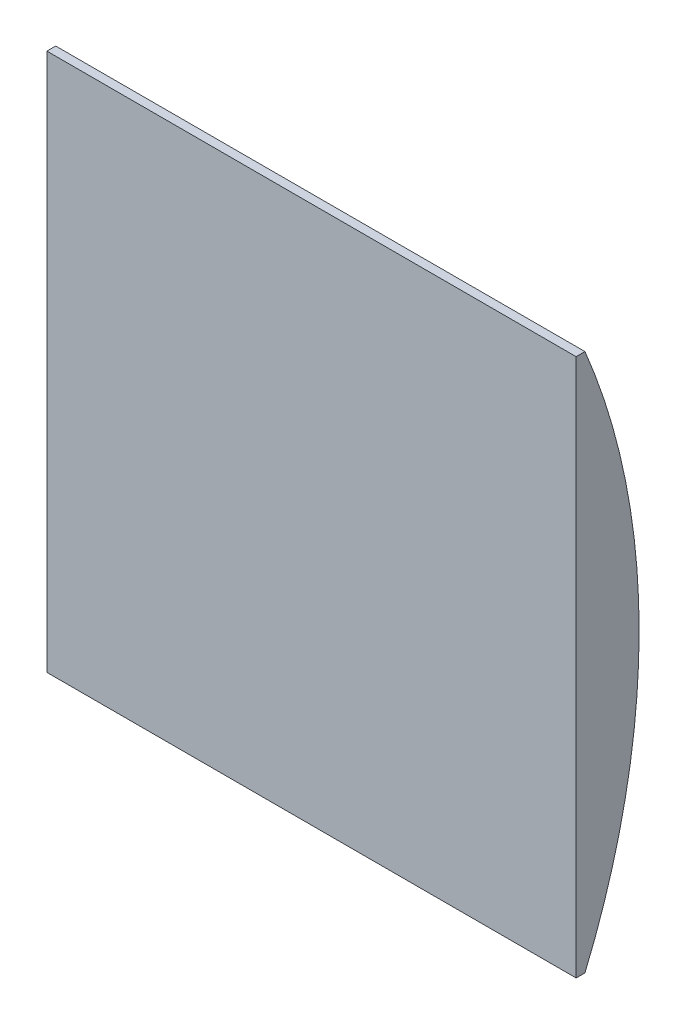
ISO-10303-21;
HEADER;
FILE_DESCRIPTION(('STEP AP214'),'2;1');
FILE_NAME('part.step','',(''),(''),'','','');
FILE_SCHEMA(('AUTOMOTIVE_DESIGN { 1 0 10303 214 1 1 1 1 }'));
ENDSEC;
DATA;
#1=APPLICATION_CONTEXT('core data for automotive mechanical design processes');
#2=APPLICATION_PROTOCOL_DEFINITION('international standard','automotive_design',2000,#1);
#3=PRODUCT_CONTEXT('',#1,'mechanical');
#4=PRODUCT('Part','Part','',(#3));
#5=PRODUCT_RELATED_PRODUCT_CATEGORY('part','',(#4));
#6=PRODUCT_DEFINITION_FORMATION('','',#4);
#7=PRODUCT_DEFINITION_CONTEXT('part definition',#1,'design');
#8=PRODUCT_DEFINITION('design','',#6,#7);
#9=PRODUCT_DEFINITION_SHAPE('','',#8);
#10=(LENGTH_UNIT() NAMED_UNIT(*) SI_UNIT(.MILLI.,.METRE.));
#11=(NAMED_UNIT(*) PLANE_ANGLE_UNIT() SI_UNIT($,.RADIAN.));
#12=(NAMED_UNIT(*) SI_UNIT($,.STERADIAN.) SOLID_ANGLE_UNIT());
#13=UNCERTAINTY_MEASURE_WITH_UNIT(LENGTH_MEASURE(1.E-05),#10,'distance_accuracy_value','');
#14=(GEOMETRIC_REPRESENTATION_CONTEXT(3) GLOBAL_UNCERTAINTY_ASSIGNED_CONTEXT((#13)) GLOBAL_UNIT_ASSIGNED_CONTEXT((#10,
#11,#12)) REPRESENTATION_CONTEXT('',''));
#15=CARTESIAN_POINT('',(0.,0.,0.));
#16=DIRECTION('',(0.,0.,1.));
#17=DIRECTION('',(1.,0.,0.));
#18=AXIS2_PLACEMENT_3D('',#15,#16,#17);
#19=CARTESIAN_POINT('',(300.,278.103448275862,8.87931034482763));
#20=DIRECTION('',(0.,-1.,0.));
#21=DIRECTION('',(0.,0.,-1.));
#22=AXIS2_PLACEMENT_3D('',#19,#20,#21);
#23=PLANE('',#22);
#24=DIRECTION('',(0.,0.,1.));
#25=VECTOR('',#24,1.);
#26=CARTESIAN_POINT('',(0.,278.103448275862,8.87931034482763));
#27=LINE('',#26,#25);
#28=CARTESIAN_POINT('',(0.,278.103448275862,3.87931034482764));
#29=VERTEX_POINT('',#28);
#30=CARTESIAN_POINT('',(0.,278.103448275862,8.87931034482763));
#31=VERTEX_POINT('',#30);
#32=EDGE_CURVE('E142',#29,#31,#27,.T.);
#33=ORIENTED_EDGE('',*,*,#32,.T.);
#34=DIRECTION('',(-1.,0.,0.));
#35=VECTOR('',#34,1.);
#36=CARTESIAN_POINT('',(300.,278.103448275862,8.87931034482763));
#37=LINE('',#36,#35);
#38=CARTESIAN_POINT('',(300.,278.103448275862,8.87931034482763));
#39=VERTEX_POINT('',#38);
#40=EDGE_CURVE('E181',#39,#31,#37,.T.);
#41=ORIENTED_EDGE('',*,*,#40,.F.);
#42=DIRECTION('',(0.,0.,1.));
#43=VECTOR('',#42,1.);
#44=CARTESIAN_POINT('',(300.,278.103448275862,8.87931034482763));
#45=LINE('',#44,#43);
#46=CARTESIAN_POINT('',(300.,278.103448275862,3.87931034482764));
#47=VERTEX_POINT('',#46);
#48=EDGE_CURVE('E155',#47,#39,#45,.T.);
#49=ORIENTED_EDGE('',*,*,#48,.F.);
#50=DIRECTION('',(-1.,0.,0.));
#51=VECTOR('',#50,1.);
#52=CARTESIAN_POINT('',(300.,278.103448275862,3.87931034482764));
#53=LINE('',#52,#51);
#54=EDGE_CURVE('E165',#47,#29,#53,.T.);
#55=ORIENTED_EDGE('',*,*,#54,.T.);
#56=EDGE_LOOP('',(#33,#41,#49,#55));
#57=FACE_BOUND('',#56,.T.);
#58=ADVANCED_FACE('F40',(#57),#23,.F.);
#59=CARTESIAN_POINT('',(300.,278.103448275862,8.87931034482763));
#60=DIRECTION('',(0.,0.,-1.));
#61=DIRECTION('',(0.,1.,0.));
#62=AXIS2_PLACEMENT_3D('',#59,#60,#61);
#63=PLANE('',#62);
#64=DIRECTION('',(0.,-1.,0.));
#65=VECTOR('',#64,1.);
#66=CARTESIAN_POINT('',(0.,278.103448275862,8.87931034482763));
#67=LINE('',#66,#65);
#68=CARTESIAN_POINT('',(0.,-26.8965517241379,8.87931034482759));
#69=VERTEX_POINT('',#68);
#70=EDGE_CURVE('E168',#31,#69,#67,.T.);
#71=ORIENTED_EDGE('',*,*,#70,.T.);
#72=DIRECTION('',(-1.,0.,0.));
#73=VECTOR('',#72,1.);
#74=CARTESIAN_POINT('',(300.,-26.8965517241379,8.87931034482759));
#75=LINE('',#74,#73);
#76=CARTESIAN_POINT('',(300.,-26.8965517241379,8.87931034482759));
#77=VERTEX_POINT('',#76);
#78=EDGE_CURVE('E178',#77,#69,#75,.T.);
#79=ORIENTED_EDGE('',*,*,#78,.F.);
#80=DIRECTION('',(0.,-1.,0.));
#81=VECTOR('',#80,1.);
#82=CARTESIAN_POINT('',(300.,278.103448275862,8.87931034482763));
#83=LINE('',#82,#81);
#84=EDGE_CURVE('E158',#39,#77,#83,.T.);
#85=ORIENTED_EDGE('',*,*,#84,.F.);
#86=ORIENTED_EDGE('',*,*,#40,.T.);
#87=EDGE_LOOP('',(#71,#79,#85,#86));
#88=FACE_BOUND('',#87,.T.);
#89=ADVANCED_FACE('F209',(#88),#63,.F.);
#90=CARTESIAN_POINT('',(300.,-26.8965517241379,8.87931034482759));
#91=DIRECTION('',(0.,1.,0.));
#92=DIRECTION('',(0.,0.,1.));
#93=AXIS2_PLACEMENT_3D('',#90,#91,#92);
#94=PLANE('',#93);
#95=DIRECTION('',(0.,0.,-1.));
#96=VECTOR('',#95,1.);
#97=CARTESIAN_POINT('',(0.,-26.8965517241379,8.87931034482759));
#98=LINE('',#97,#96);
#99=CARTESIAN_POINT('',(0.,-26.8965517241379,3.87931034482759));
#100=VERTEX_POINT('',#99);
#101=EDGE_CURVE('E170',#69,#100,#98,.T.);
#102=ORIENTED_EDGE('',*,*,#101,.T.);
#103=DIRECTION('',(-1.,0.,0.));
#104=VECTOR('',#103,1.);
#105=CARTESIAN_POINT('',(300.,-26.8965517241379,3.87931034482759));
#106=LINE('',#105,#104);
#107=CARTESIAN_POINT('',(300.,-26.8965517241379,3.87931034482759));
#108=VERTEX_POINT('',#107);
#109=EDGE_CURVE('E175',#108,#100,#106,.T.);
#110=ORIENTED_EDGE('',*,*,#109,.F.);
#111=DIRECTION('',(0.,0.,-1.));
#112=VECTOR('',#111,1.);
#113=CARTESIAN_POINT('',(300.,-26.8965517241379,8.87931034482759));
#114=LINE('',#113,#112);
#115=EDGE_CURVE('E161',#77,#108,#114,.T.);
#116=ORIENTED_EDGE('',*,*,#115,.F.);
#117=ORIENTED_EDGE('',*,*,#78,.T.);
#118=EDGE_LOOP('',(#102,#110,#116,#117));
#119=FACE_BOUND('',#118,.T.);
#120=ADVANCED_FACE('F214',(#119),#94,.F.);
#121=CARTESIAN_POINT('',(300.,125.603448275862,367.503064555066));
#122=DIRECTION('',(-1.,0.,0.));
#123=DIRECTION('',(0.,0.,1.));
#124=AXIS2_PLACEMENT_3D('',#121,#122,#123);
#125=CYLINDRICAL_SURFACE('',#124,394.307601532038);
#126=CARTESIAN_POINT('',(250.,125.603448275862,367.503064555066));
#127=DIRECTION('',(1.,0.,0.));
#128=DIRECTION('',(0.,0.,-1.));
#129=AXIS2_PLACEMENT_3D('',#126,#127,#128);
#130=CIRCLE('',#129,394.307601532038);
#131=CARTESIAN_POINT('',(250.,28.1034482758621,-14.5600645557498));
#132=VERTEX_POINT('',#131);
#133=CARTESIAN_POINT('',(250.,249.588544401491,-6.80453697697136));
#134=VERTEX_POINT('',#133);
#135=EDGE_CURVE('E132',#132,#134,#130,.T.);
#136=ORIENTED_EDGE('',*,*,#135,.T.);
#137=DIRECTION('',(-1.,0.,0.));
#138=VECTOR('',#137,1.);
#139=CARTESIAN_POINT('',(300.,249.588544401491,-6.80453697697136));
#140=LINE('',#139,#138);
#141=CARTESIAN_POINT('',(200.,249.588544401491,-6.80453697697136));
#142=VERTEX_POINT('',#141);
#143=EDGE_CURVE('E11',#134,#142,#140,.T.);
#144=ORIENTED_EDGE('',*,*,#143,.T.);
#145=CARTESIAN_POINT('',(200.,125.603448275862,367.503064555066));
#146=DIRECTION('',(-1.,0.,0.));
#147=DIRECTION('',(0.,-1.,0.));
#148=AXIS2_PLACEMENT_3D('',#145,#146,#147);
#149=CIRCLE('',#148,394.307601532038);
#150=CARTESIAN_POINT('',(200.,28.1034482758621,-14.5600645557498));
#151=VERTEX_POINT('',#150);
#152=EDGE_CURVE('E54',#142,#151,#149,.T.);
#153=ORIENTED_EDGE('',*,*,#152,.T.);
#154=DIRECTION('',(-1.,0.,0.));
#155=VECTOR('',#154,1.);
#156=CARTESIAN_POINT('',(300.,28.1034482758621,-14.5600645557498));
#157=LINE('',#156,#155);
#158=EDGE_CURVE('E47',#151,#132,#157,.F.);
#159=ORIENTED_EDGE('',*,*,#158,.T.);
#160=EDGE_LOOP('',(#136,#144,#153,#159));
#161=FACE_BOUND('',#160,.T.);
#162=CARTESIAN_POINT('',(100.,125.603448275862,367.503064555066));
#163=DIRECTION('',(1.,0.,0.));
#164=DIRECTION('',(0.,0.,-1.));
#165=AXIS2_PLACEMENT_3D('',#162,#163,#164);
#166=CIRCLE('',#165,394.307601532038);
#167=CARTESIAN_POINT('',(100.,28.1034482758621,-14.5600645557498));
#168=VERTEX_POINT('',#167);
#169=CARTESIAN_POINT('',(100.,249.588544401491,-6.80453697697136));
#170=VERTEX_POINT('',#169);
#171=EDGE_CURVE('E185',#168,#170,#166,.T.);
#172=ORIENTED_EDGE('',*,*,#171,.T.);
#173=DIRECTION('',(-1.,0.,0.));
#174=VECTOR('',#173,1.);
#175=CARTESIAN_POINT('',(300.,249.588544401491,-6.80453697697136));
#176=LINE('',#175,#174);
#177=CARTESIAN_POINT('',(49.9999999999999,249.588544401491,-6.80453697697136));
#178=VERTEX_POINT('',#177);
#179=EDGE_CURVE('E190',#170,#178,#176,.T.);
#180=ORIENTED_EDGE('',*,*,#179,.T.);
#181=CARTESIAN_POINT('',(50.,125.603448275862,367.503064555066));
#182=DIRECTION('',(-1.,0.,0.));
#183=DIRECTION('',(0.,-1.,0.));
#184=AXIS2_PLACEMENT_3D('',#181,#182,#183);
#185=CIRCLE('',#184,394.307601532038);
#186=CARTESIAN_POINT('',(50.,28.1034482758621,-14.5600645557498));
#187=VERTEX_POINT('',#186);
#188=EDGE_CURVE('E62',#178,#187,#185,.T.);
#189=ORIENTED_EDGE('',*,*,#188,.T.);
#190=DIRECTION('',(-1.,0.,0.));
#191=VECTOR('',#190,1.);
#192=CARTESIAN_POINT('',(300.,28.1034482758621,-14.5600645557498));
#193=LINE('',#192,#191);
#194=EDGE_CURVE('E187',#187,#168,#193,.F.);
#195=ORIENTED_EDGE('',*,*,#194,.T.);
#196=EDGE_LOOP('',(#172,#180,#189,#195));
#197=FACE_BOUND('',#196,.T.);
#198=CARTESIAN_POINT('',(0.,125.603448275862,367.503064555066));
#199=DIRECTION('',(1.,0.,0.));
#200=DIRECTION('',(0.,0.,1.));
#201=AXIS2_PLACEMENT_3D('',#198,#199,#200);
#202=CIRCLE('',#201,394.307601532038);
#203=EDGE_CURVE('E159',#100,#29,#202,.T.);
#204=ORIENTED_EDGE('',*,*,#203,.T.);
#205=ORIENTED_EDGE('',*,*,#54,.F.);
#206=CARTESIAN_POINT('',(300.,125.603448275862,367.503064555066));
#207=DIRECTION('',(1.,0.,0.));
#208=DIRECTION('',(0.,0.,1.));
#209=AXIS2_PLACEMENT_3D('',#206,#207,#208);
#210=CIRCLE('',#209,394.307601532038);
#211=EDGE_CURVE('E163',#108,#47,#210,.T.);
#212=ORIENTED_EDGE('',*,*,#211,.F.);
#213=ORIENTED_EDGE('',*,*,#109,.T.);
#214=EDGE_LOOP('',(#204,#205,#212,#213));
#215=FACE_BOUND('',#214,.T.);
#216=ADVANCED_FACE('F195',(#161,#197,#215),#125,.T.);
#217=CARTESIAN_POINT('',(300.,125.603448275862,367.503064555066));
#218=DIRECTION('',(-1.,0.,0.));
#219=DIRECTION('',(0.,0.,1.));
#220=AXIS2_PLACEMENT_3D('',#217,#218,#219);
#221=PLANE('',#220);
#222=ORIENTED_EDGE('',*,*,#48,.T.);
#223=ORIENTED_EDGE('',*,*,#84,.T.);
#224=ORIENTED_EDGE('',*,*,#115,.T.);
#225=ORIENTED_EDGE('',*,*,#211,.T.);
#226=EDGE_LOOP('',(#222,#223,#224,#225));
#227=FACE_BOUND('',#226,.T.);
#228=ADVANCED_FACE('F227',(#227),#221,.F.);
#229=CARTESIAN_POINT('',(0.,125.603448275862,367.503064555066));
#230=DIRECTION('',(-1.,0.,0.));
#231=DIRECTION('',(0.,0.,1.));
#232=AXIS2_PLACEMENT_3D('',#229,#230,#231);
#233=PLANE('',#232);
#234=ORIENTED_EDGE('',*,*,#32,.F.);
#235=ORIENTED_EDGE('',*,*,#203,.F.);
#236=ORIENTED_EDGE('',*,*,#101,.F.);
#237=ORIENTED_EDGE('',*,*,#70,.F.);
#238=EDGE_LOOP('',(#234,#235,#236,#237));
#239=FACE_BOUND('',#238,.T.);
#240=ADVANCED_FACE('F222',(#239),#233,.T.);
#241=CARTESIAN_POINT('',(100.,28.1034482758621,-6.80453697697136));
#242=DIRECTION('',(1.,0.,0.));
#243=DIRECTION('',(0.,0.,-1.));
#244=AXIS2_PLACEMENT_3D('',#241,#242,#243);
#245=PLANE('',#244);
#246=ORIENTED_EDGE('',*,*,#171,.F.);
#247=DIRECTION('',(0.,0.,-1.));
#248=VECTOR('',#247,1.);
#249=CARTESIAN_POINT('',(100.,28.1034482758621,-6.80453697697136));
#250=LINE('',#249,#248);
#251=CARTESIAN_POINT('',(100.,28.1034482758621,-6.80453697697136));
#252=VERTEX_POINT('',#251);
#253=EDGE_CURVE('E144',#252,#168,#250,.T.);
#254=ORIENTED_EDGE('',*,*,#253,.F.);
#255=DIRECTION('',(0.,-1.,0.));
#256=VECTOR('',#255,1.);
#257=CARTESIAN_POINT('',(100.,28.1034482758621,-6.80453697697136));
#258=LINE('',#257,#256);
#259=EDGE_CURVE('E127',#170,#252,#258,.T.);
#260=ORIENTED_EDGE('',*,*,#259,.F.);
#261=EDGE_LOOP('',(#246,#254,#260));
#262=FACE_BOUND('',#261,.T.);
#263=ADVANCED_FACE('F241',(#262),#245,.F.);
#264=CARTESIAN_POINT('',(50.,278.103448275862,-6.80453697697136));
#265=DIRECTION('',(-1.,0.,0.));
#266=DIRECTION('',(0.,-1.,0.));
#267=AXIS2_PLACEMENT_3D('',#264,#265,#266);
#268=PLANE('',#267);
#269=DIRECTION('',(0.,1.,0.));
#270=VECTOR('',#269,1.);
#271=CARTESIAN_POINT('',(50.,278.103448275862,-6.80453697697136));
#272=LINE('',#271,#270);
#273=CARTESIAN_POINT('',(50.,28.1034482758621,-6.80453697697136));
#274=VERTEX_POINT('',#273);
#275=EDGE_CURVE('E147',#274,#178,#272,.T.);
#276=ORIENTED_EDGE('',*,*,#275,.F.);
#277=DIRECTION('',(0.,0.,-1.));
#278=VECTOR('',#277,1.);
#279=CARTESIAN_POINT('',(50.,28.1034482758621,-6.80453697697136));
#280=LINE('',#279,#278);
#281=EDGE_CURVE('E148',#274,#187,#280,.T.);
#282=ORIENTED_EDGE('',*,*,#281,.T.);
#283=ORIENTED_EDGE('',*,*,#188,.F.);
#284=EDGE_LOOP('',(#276,#282,#283));
#285=FACE_BOUND('',#284,.T.);
#286=ADVANCED_FACE('F248',(#285),#268,.F.);
#287=CARTESIAN_POINT('',(50.,28.1034482758621,-6.80453697697136));
#288=DIRECTION('',(0.,-1.,0.));
#289=DIRECTION('',(1.,0.,0.));
#290=AXIS2_PLACEMENT_3D('',#287,#288,#289);
#291=PLANE('',#290);
#292=ORIENTED_EDGE('',*,*,#281,.F.);
#293=DIRECTION('',(-1.,0.,0.));
#294=VECTOR('',#293,1.);
#295=CARTESIAN_POINT('',(50.,28.1034482758621,-6.80453697697136));
#296=LINE('',#295,#294);
#297=EDGE_CURVE('E151',#252,#274,#296,.T.);
#298=ORIENTED_EDGE('',*,*,#297,.F.);
#299=ORIENTED_EDGE('',*,*,#253,.T.);
#300=ORIENTED_EDGE('',*,*,#194,.F.);
#301=EDGE_LOOP('',(#292,#298,#299,#300));
#302=FACE_BOUND('',#301,.T.);
#303=ADVANCED_FACE('F246',(#302),#291,.F.);
#304=CARTESIAN_POINT('',(0.,0.,-6.80453697697136));
#305=DIRECTION('',(0.,0.,1.));
#306=DIRECTION('',(1.,0.,0.));
#307=AXIS2_PLACEMENT_3D('',#304,#305,#306);
#308=PLANE('',#307);
#309=ORIENTED_EDGE('',*,*,#259,.T.);
#310=ORIENTED_EDGE('',*,*,#297,.T.);
#311=ORIENTED_EDGE('',*,*,#275,.T.);
#312=ORIENTED_EDGE('',*,*,#179,.F.);
#313=EDGE_LOOP('',(#309,#310,#311,#312));
#314=FACE_BOUND('',#313,.T.);
#315=ADVANCED_FACE('F205',(#314),#308,.F.);
#316=CARTESIAN_POINT('',(250.,28.1034482758621,-6.80453697697136));
#317=DIRECTION('',(1.,0.,0.));
#318=DIRECTION('',(0.,0.,-1.));
#319=AXIS2_PLACEMENT_3D('',#316,#317,#318);
#320=PLANE('',#319);
#321=ORIENTED_EDGE('',*,*,#135,.F.);
#322=DIRECTION('',(0.,0.,-1.));
#323=VECTOR('',#322,1.);
#324=CARTESIAN_POINT('',(250.,28.1034482758621,-6.80453697697136));
#325=LINE('',#324,#323);
#326=CARTESIAN_POINT('',(250.,28.1034482758621,-6.80453697697136));
#327=VERTEX_POINT('',#326);
#328=EDGE_CURVE('E130',#327,#132,#325,.T.);
#329=ORIENTED_EDGE('',*,*,#328,.F.);
#330=DIRECTION('',(0.,-1.,0.));
#331=VECTOR('',#330,1.);
#332=CARTESIAN_POINT('',(250.,28.1034482758621,-6.80453697697136));
#333=LINE('',#332,#331);
#334=EDGE_CURVE('E121',#134,#327,#333,.T.);
#335=ORIENTED_EDGE('',*,*,#334,.F.);
#336=EDGE_LOOP('',(#321,#329,#335));
#337=FACE_BOUND('',#336,.T.);
#338=ADVANCED_FACE('F131',(#337),#320,.F.);
#339=CARTESIAN_POINT('',(200.,278.103448275862,-6.80453697697136));
#340=DIRECTION('',(-1.,0.,0.));
#341=DIRECTION('',(0.,-1.,0.));
#342=AXIS2_PLACEMENT_3D('',#339,#340,#341);
#343=PLANE('',#342);
#344=DIRECTION('',(0.,1.,0.));
#345=VECTOR('',#344,1.);
#346=CARTESIAN_POINT('',(200.,278.103448275862,-6.80453697697136));
#347=LINE('',#346,#345);
#348=CARTESIAN_POINT('',(200.,28.1034482758621,-6.80453697697136));
#349=VERTEX_POINT('',#348);
#350=EDGE_CURVE('E136',#349,#142,#347,.T.);
#351=ORIENTED_EDGE('',*,*,#350,.F.);
#352=DIRECTION('',(0.,0.,-1.));
#353=VECTOR('',#352,1.);
#354=CARTESIAN_POINT('',(200.,28.1034482758621,-6.80453697697136));
#355=LINE('',#354,#353);
#356=EDGE_CURVE('E135',#349,#151,#355,.T.);
#357=ORIENTED_EDGE('',*,*,#356,.T.);
#358=ORIENTED_EDGE('',*,*,#152,.F.);
#359=EDGE_LOOP('',(#351,#357,#358));
#360=FACE_BOUND('',#359,.T.);
#361=ADVANCED_FACE('F197',(#360),#343,.F.);
#362=CARTESIAN_POINT('',(200.,28.1034482758621,-6.80453697697136));
#363=DIRECTION('',(0.,-1.,0.));
#364=DIRECTION('',(1.,0.,0.));
#365=AXIS2_PLACEMENT_3D('',#362,#363,#364);
#366=PLANE('',#365);
#367=ORIENTED_EDGE('',*,*,#356,.F.);
#368=DIRECTION('',(-1.,0.,0.));
#369=VECTOR('',#368,1.);
#370=CARTESIAN_POINT('',(200.,28.1034482758621,-6.80453697697136));
#371=LINE('',#370,#369);
#372=EDGE_CURVE('E125',#327,#349,#371,.T.);
#373=ORIENTED_EDGE('',*,*,#372,.F.);
#374=ORIENTED_EDGE('',*,*,#328,.T.);
#375=ORIENTED_EDGE('',*,*,#158,.F.);
#376=EDGE_LOOP('',(#367,#373,#374,#375));
#377=FACE_BOUND('',#376,.T.);
#378=ADVANCED_FACE('F138',(#377),#366,.F.);
#379=CARTESIAN_POINT('',(0.,0.,-6.80453697697136));
#380=DIRECTION('',(0.,0.,1.));
#381=DIRECTION('',(1.,0.,0.));
#382=AXIS2_PLACEMENT_3D('',#379,#380,#381);
#383=PLANE('',#382);
#384=ORIENTED_EDGE('',*,*,#334,.T.);
#385=ORIENTED_EDGE('',*,*,#372,.T.);
#386=ORIENTED_EDGE('',*,*,#350,.T.);
#387=ORIENTED_EDGE('',*,*,#143,.F.);
#388=EDGE_LOOP('',(#384,#385,#386,#387));
#389=FACE_BOUND('',#388,.T.);
#390=ADVANCED_FACE('F123',(#389),#383,.F.);
#391=CLOSED_SHELL('',(#58,#89,#120,#216,#228,#240,#263,#286,#303,#315,#338,#361,#378,#390));
#392=MANIFOLD_SOLID_BREP('B2',#391);
#393=ADVANCED_BREP_SHAPE_REPRESENTATION('',(#18,#392),#14);
#394=SHAPE_DEFINITION_REPRESENTATION(#9,#393);
ENDSEC;
END-ISO-10303-21;
